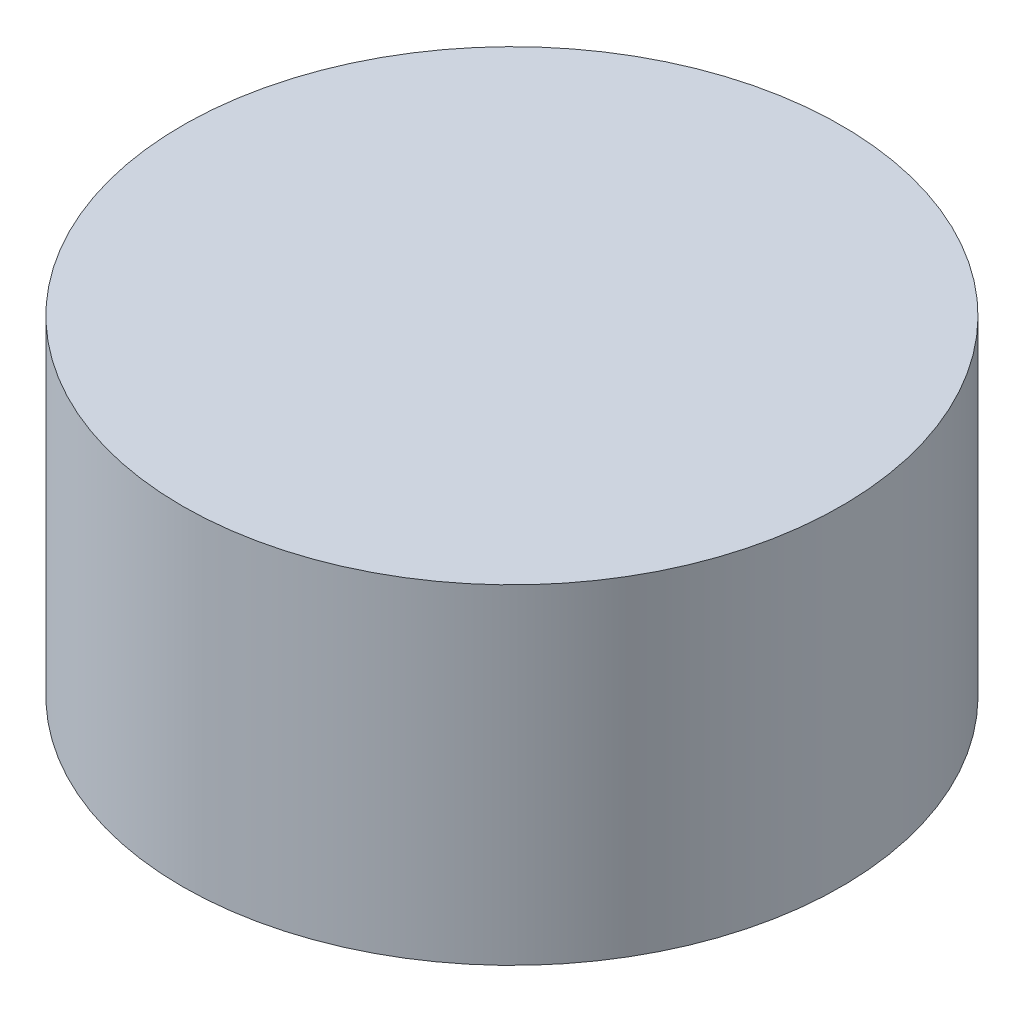
ISO-10303-21;
HEADER;
FILE_DESCRIPTION(('STEP AP214'),'2;1');
FILE_NAME('part.step','',(''),(''),'','','');
FILE_SCHEMA(('AUTOMOTIVE_DESIGN { 1 0 10303 214 1 1 1 1 }'));
ENDSEC;
DATA;
#1=APPLICATION_CONTEXT('core data for automotive mechanical design processes');
#2=APPLICATION_PROTOCOL_DEFINITION('international standard','automotive_design',2000,#1);
#3=PRODUCT_CONTEXT('',#1,'mechanical');
#4=PRODUCT('Part','Part','',(#3));
#5=PRODUCT_RELATED_PRODUCT_CATEGORY('part','',(#4));
#6=PRODUCT_DEFINITION_FORMATION('','',#4);
#7=PRODUCT_DEFINITION_CONTEXT('part definition',#1,'design');
#8=PRODUCT_DEFINITION('design','',#6,#7);
#9=PRODUCT_DEFINITION_SHAPE('','',#8);
#10=(LENGTH_UNIT() NAMED_UNIT(*) SI_UNIT(.MILLI.,.METRE.));
#11=(NAMED_UNIT(*) PLANE_ANGLE_UNIT() SI_UNIT($,.RADIAN.));
#12=(NAMED_UNIT(*) SI_UNIT($,.STERADIAN.) SOLID_ANGLE_UNIT());
#13=UNCERTAINTY_MEASURE_WITH_UNIT(LENGTH_MEASURE(1.E-05),#10,'distance_accuracy_value','');
#14=(GEOMETRIC_REPRESENTATION_CONTEXT(3) GLOBAL_UNCERTAINTY_ASSIGNED_CONTEXT((#13)) GLOBAL_UNIT_ASSIGNED_CONTEXT((#10,
#11,#12)) REPRESENTATION_CONTEXT('',''));
#15=CARTESIAN_POINT('',(0.,0.,0.));
#16=DIRECTION('',(0.,0.,1.));
#17=DIRECTION('',(1.,0.,0.));
#18=AXIS2_PLACEMENT_3D('',#15,#16,#17);
#19=CARTESIAN_POINT('',(0.,4.,0.));
#20=DIRECTION('',(0.,-1.,0.));
#21=DIRECTION('',(0.,0.,-1.));
#22=AXIS2_PLACEMENT_3D('',#19,#20,#21);
#23=CYLINDRICAL_SURFACE('',#22,4.);
#24=CARTESIAN_POINT('',(0.,4.,0.));
#25=DIRECTION('',(0.,1.,0.));
#26=DIRECTION('',(0.,0.,1.));
#27=AXIS2_PLACEMENT_3D('',#24,#25,#26);
#28=CIRCLE('',#27,4.);
#29=CARTESIAN_POINT('',(0.,4.,4.));
#30=VERTEX_POINT('',#29);
#31=EDGE_CURVE('E10',#30,#30,#28,.T.);
#32=ORIENTED_EDGE('',*,*,#31,.F.);
#33=EDGE_LOOP('',(#32));
#34=FACE_BOUND('',#33,.T.);
#35=CARTESIAN_POINT('',(0.,0.,0.));
#36=DIRECTION('',(0.,1.,0.));
#37=DIRECTION('',(0.,0.,1.));
#38=AXIS2_PLACEMENT_3D('',#35,#36,#37);
#39=CIRCLE('',#38,4.);
#40=CARTESIAN_POINT('',(0.,0.,4.));
#41=VERTEX_POINT('',#40);
#42=EDGE_CURVE('E36',#41,#41,#39,.T.);
#43=ORIENTED_EDGE('',*,*,#42,.T.);
#44=EDGE_LOOP('',(#43));
#45=FACE_BOUND('',#44,.T.);
#46=ADVANCED_FACE('F33',(#34,#45),#23,.T.);
#47=CARTESIAN_POINT('',(0.,4.,0.));
#48=DIRECTION('',(0.,1.,0.));
#49=DIRECTION('',(0.,0.,1.));
#50=AXIS2_PLACEMENT_3D('',#47,#48,#49);
#51=PLANE('',#50);
#52=ORIENTED_EDGE('',*,*,#31,.T.);
#53=EDGE_LOOP('',(#52));
#54=FACE_BOUND('',#53,.T.);
#55=ADVANCED_FACE('F48',(#54),#51,.T.);
#56=CARTESIAN_POINT('',(0.,0.,0.));
#57=DIRECTION('',(0.,1.,0.));
#58=DIRECTION('',(0.,0.,1.));
#59=AXIS2_PLACEMENT_3D('',#56,#57,#58);
#60=PLANE('',#59);
#61=ORIENTED_EDGE('',*,*,#42,.F.);
#62=EDGE_LOOP('',(#61));
#63=FACE_BOUND('',#62,.T.);
#64=ADVANCED_FACE('F46',(#63),#60,.F.);
#65=CLOSED_SHELL('',(#46,#55,#64));
#66=MANIFOLD_SOLID_BREP('B2',#65);
#67=ADVANCED_BREP_SHAPE_REPRESENTATION('',(#18,#66),#14);
#68=SHAPE_DEFINITION_REPRESENTATION(#9,#67);
ENDSEC;
END-ISO-10303-21;
